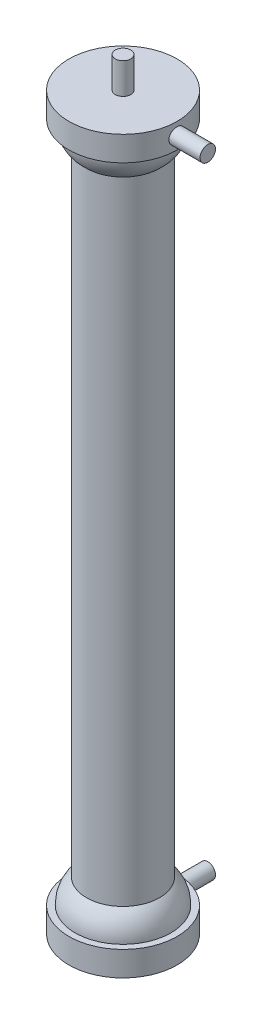
ISO-10303-21;
HEADER;
FILE_DESCRIPTION(('STEP AP214'),'2;1');
FILE_NAME('part.step','',(''),(''),'','','');
FILE_SCHEMA(('AUTOMOTIVE_DESIGN { 1 0 10303 214 1 1 1 1 }'));
ENDSEC;
DATA;
#1=APPLICATION_CONTEXT('core data for automotive mechanical design processes');
#2=APPLICATION_PROTOCOL_DEFINITION('international standard','automotive_design',2000,#1);
#3=PRODUCT_CONTEXT('',#1,'mechanical');
#4=PRODUCT('Part','Part','',(#3));
#5=PRODUCT_RELATED_PRODUCT_CATEGORY('part','',(#4));
#6=PRODUCT_DEFINITION_FORMATION('','',#4);
#7=PRODUCT_DEFINITION_CONTEXT('part definition',#1,'design');
#8=PRODUCT_DEFINITION('design','',#6,#7);
#9=PRODUCT_DEFINITION_SHAPE('','',#8);
#10=(LENGTH_UNIT() NAMED_UNIT(*) SI_UNIT(.MILLI.,.METRE.));
#11=(NAMED_UNIT(*) PLANE_ANGLE_UNIT() SI_UNIT($,.RADIAN.));
#12=(NAMED_UNIT(*) SI_UNIT($,.STERADIAN.) SOLID_ANGLE_UNIT());
#13=UNCERTAINTY_MEASURE_WITH_UNIT(LENGTH_MEASURE(1.E-05),#10,'distance_accuracy_value','');
#14=(GEOMETRIC_REPRESENTATION_CONTEXT(3) GLOBAL_UNCERTAINTY_ASSIGNED_CONTEXT((#13)) GLOBAL_UNIT_ASSIGNED_CONTEXT((#10,
#11,#12)) REPRESENTATION_CONTEXT('',''));
#15=CARTESIAN_POINT('',(0.,0.,0.));
#16=DIRECTION('',(0.,0.,1.));
#17=DIRECTION('',(1.,0.,0.));
#18=AXIS2_PLACEMENT_3D('',#15,#16,#17);
#19=CARTESIAN_POINT('',(0.,-1025.4,0.));
#20=DIRECTION('',(0.,-1.,0.));
#21=DIRECTION('',(0.,0.,-1.));
#22=AXIS2_PLACEMENT_3D('',#19,#20,#21);
#23=CYLINDRICAL_SURFACE('',#22,22.225);
#24=CARTESIAN_POINT('',(0.,302.54,0.));
#25=DIRECTION('',(0.,-1.,0.));
#26=DIRECTION('',(0.,0.,-1.));
#27=AXIS2_PLACEMENT_3D('',#24,#25,#26);
#28=CIRCLE('',#27,22.225);
#29=CARTESIAN_POINT('',(0.,302.54,-22.225));
#30=VERTEX_POINT('',#29);
#31=EDGE_CURVE('E107',#30,#30,#28,.T.);
#32=ORIENTED_EDGE('',*,*,#31,.F.);
#33=EDGE_LOOP('',(#32));
#34=FACE_BOUND('',#33,.T.);
#35=CARTESIAN_POINT('',(0.,312.7,0.));
#36=DIRECTION('',(0.,-1.,0.));
#37=DIRECTION('',(0.,0.,-1.));
#38=AXIS2_PLACEMENT_3D('',#35,#36,#37);
#39=CIRCLE('',#38,22.225);
#40=CARTESIAN_POINT('',(0.,312.7,-22.225));
#41=VERTEX_POINT('',#40);
#42=EDGE_CURVE('E111',#41,#41,#39,.T.);
#43=ORIENTED_EDGE('',*,*,#42,.T.);
#44=EDGE_LOOP('',(#43));
#45=FACE_BOUND('',#44,.T.);
#46=CARTESIAN_POINT('',(21.9970452561247,307.62,3.175));
#47=CARTESIAN_POINT('',(21.9970481082156,307.797362121844,3.17499260409125));
#48=CARTESIAN_POINT('',(21.9992135575726,307.974829606526,3.16008804904672));
#49=CARTESIAN_POINT('',(22.0076363111921,308.324809735322,3.10087549968881));
#50=CARTESIAN_POINT('',(22.0138976930162,308.49731726288,3.05653820399453));
#51=CARTESIAN_POINT('',(22.0297889769634,308.832260561296,2.93980772902896));
#52=CARTESIAN_POINT('',(22.0394163844335,308.994703686485,2.86743532306302));
#53=CARTESIAN_POINT('',(22.0609519822444,309.30511494553,2.69673666724123));
#54=CARTESIAN_POINT('',(22.0728598355627,309.453085213426,2.59841425167402));
#55=CARTESIAN_POINT('',(22.097711475932,309.731451669658,2.37784238108815));
#56=CARTESIAN_POINT('',(22.1106614947546,309.861727345762,2.25544152078387));
#57=CARTESIAN_POINT('',(22.1360825870052,310.099963222119,1.99051398786036));
#58=CARTESIAN_POINT('',(22.1485536348521,310.207922231816,1.84798624218868));
#59=CARTESIAN_POINT('',(22.1716764627384,310.398901442694,1.54608273463255));
#60=CARTESIAN_POINT('',(22.1823200989089,310.481811196798,1.38663642886806));
#61=CARTESIAN_POINT('',(22.2005199793149,310.619630042333,1.05590458421643));
#62=CARTESIAN_POINT('',(22.2080763718529,310.674540478803,0.884619614487445));
#63=CARTESIAN_POINT('',(22.2192064188926,310.754438116056,0.536311575871271));
#64=CARTESIAN_POINT('',(22.2228068738,310.779626761071,0.359335586048447));
#65=CARTESIAN_POINT('',(22.2257111283058,310.799990938974,0.00363468487948518));
#66=CARTESIAN_POINT('',(22.2250151455792,310.795167992371,-0.175090137405636));
#67=CARTESIAN_POINT('',(22.2194264377293,310.755805612082,-0.527842150095034));
#68=CARTESIAN_POINT('',(22.2145643168523,310.721482876774,-0.701894074636488));
#69=CARTESIAN_POINT('',(22.2012237809256,310.624434936478,-1.04174225726678));
#70=CARTESIAN_POINT('',(22.1927452799447,310.561709056582,-1.20753831907821));
#71=CARTESIAN_POINT('',(22.1730719283893,310.409410942656,-1.52682887224375));
#72=CARTESIAN_POINT('',(22.1618677947259,310.319746710099,-1.68027888605579));
#73=CARTESIAN_POINT('',(22.1379933588026,310.116184217775,-1.97003641446849));
#74=CARTESIAN_POINT('',(22.1253229689117,310.002284509229,-2.10634290346627));
#75=CARTESIAN_POINT('',(22.0997971284829,309.752275069839,-2.35922024831388));
#76=CARTESIAN_POINT('',(22.0869410354408,309.615976239261,-2.47560416314841));
#77=CARTESIAN_POINT('',(22.0626034152762,309.325682197231,-2.6838749597432));
#78=CARTESIAN_POINT('',(22.0511218951963,309.171686895119,-2.77576171599433));
#79=CARTESIAN_POINT('',(22.0308337272164,308.850185039774,-2.93245066164261));
#80=CARTESIAN_POINT('',(22.0220288503466,308.682669633161,-2.99723492899696));
#81=CARTESIAN_POINT('',(22.0081231447171,308.338982592026,-3.09769865136957));
#82=CARTESIAN_POINT('',(22.0030220802935,308.162811509003,-3.13337995814979));
#83=CARTESIAN_POINT('',(21.9971458195224,307.80847349683,-3.17437120217507));
#84=CARTESIAN_POINT('',(21.9963329630993,307.630337758732,-3.17994555628349));
#85=CARTESIAN_POINT('',(21.9990252889568,307.275674734523,-3.16126508092305));
#86=CARTESIAN_POINT('',(22.0025303501077,307.099147403431,-3.13701108822351));
#87=CARTESIAN_POINT('',(22.013429057337,306.753523164205,-3.05958617595134));
#88=CARTESIAN_POINT('',(22.0208051351058,306.584396395784,-3.0065458640302));
#89=CARTESIAN_POINT('',(22.0386003729932,306.257434784038,-2.87318936047202));
#90=CARTESIAN_POINT('',(22.0490196704401,306.099600450696,-2.79287193790103));
#91=CARTESIAN_POINT('',(22.071816543563,305.798515390942,-2.60660134525824));
#92=CARTESIAN_POINT('',(22.0842070451803,305.655371974075,-2.50047633043064));
#93=CARTESIAN_POINT('',(22.1095108174966,305.388832688745,-2.2658431604142));
#94=CARTESIAN_POINT('',(22.1224241149018,305.265437830706,-2.13733386064597));
#95=CARTESIAN_POINT('',(22.1474355820708,305.040955090736,-1.86041837447802));
#96=CARTESIAN_POINT('',(22.1595268892944,304.940041995818,-1.7118697857474));
#97=CARTESIAN_POINT('',(22.1814266422619,304.764602543522,-1.39977606882429));
#98=CARTESIAN_POINT('',(22.1912351456427,304.690075519916,-1.23623131940514));
#99=CARTESIAN_POINT('',(22.2074339607805,304.569805893524,-0.899344030292883));
#100=CARTESIAN_POINT('',(22.2138358055583,304.523966078054,-0.726036773609259));
#101=CARTESIAN_POINT('',(22.2225482509749,304.462056945968,-0.374086848735212));
#102=CARTESIAN_POINT('',(22.224859095647,304.445985853607,-0.195444499436444));
#103=CARTESIAN_POINT('',(22.2251271217915,304.444110620676,0.160405969870573));
#104=CARTESIAN_POINT('',(22.22312286098,304.458038424808,0.337612707029002));
#105=CARTESIAN_POINT('',(22.2150632703669,304.515193138193,0.687137680649272));
#106=CARTESIAN_POINT('',(22.2090079501298,304.558419978271,0.859455928651776));
#107=CARTESIAN_POINT('',(22.1935234001093,304.672853839167,1.19425039676431));
#108=CARTESIAN_POINT('',(22.1840962022546,304.744044011519,1.35673247545339));
#109=CARTESIAN_POINT('',(22.1629058916315,304.912355474359,1.6674873080394));
#110=CARTESIAN_POINT('',(22.1511427173455,305.009477447781,1.81575968757256));
#111=CARTESIAN_POINT('',(22.1264646284537,305.227871997916,2.09524909499349));
#112=CARTESIAN_POINT('',(22.1135407654047,305.349343039591,2.22631026403015));
#113=CARTESIAN_POINT('',(22.0880657969985,305.612570626879,2.46628787804758));
#114=CARTESIAN_POINT('',(22.0755147800215,305.754331936527,2.57519910777255));
#115=CARTESIAN_POINT('',(22.052138519243,306.054955883341,2.76827493516724));
#116=CARTESIAN_POINT('',(22.0413223436744,306.213901545958,2.85231132449519));
#117=CARTESIAN_POINT('',(22.0227465951902,306.54372627079,2.99237245226716));
#118=CARTESIAN_POINT('',(22.014983805506,306.714592549811,3.04842668700632));
#119=CARTESIAN_POINT('',(22.0052152641794,307.008552826015,3.11799692575808));
#120=CARTESIAN_POINT('',(22.0021674508921,307.129818632467,3.13934098015756));
#121=CARTESIAN_POINT('',(21.9980814690859,307.374039412681,3.16784500269689));
#122=CARTESIAN_POINT('',(21.9970432781193,307.49699436756,3.17500512927125));
#123=CARTESIAN_POINT('',(21.9970452561247,307.62,3.175));
#124=B_SPLINE_CURVE_WITH_KNOTS('',3,(#46,#47,#48,#49,#50,#51,#52,#53,#54,#55,#56,#57,#58,#59,
#60,#61,#62,#63,#64,#65,#66,#67,#68,#69,#70,#71,#72,#73,#74,#75,#76,#77,#78,#79,#80,#81,#82,#83,
#84,#85,#86,#87,#88,#89,#90,#91,#92,#93,#94,#95,#96,#97,#98,#99,#100,#101,#102,#103,#104,#105,
#106,#107,#108,#109,#110,#111,#112,#113,#114,#115,#116,#117,#118,#119,#120,#121,#122,#123),
.UNSPECIFIED.,.T.,.F.,(4,2,2,2,2,2,2,2,2,2,2,2,2,2,2,2,2,2,2,2,2,2,2,2,2,2,2,2,2,2,2,2,2,2,2,2,
2,2,4),(0.,0.531636842186723,1.06380374381045,1.59557707521229,2.12727187746934,
2.66242348592814,3.19760363644328,3.73511017448152,4.27259088918993,4.80640742645053,
5.34019691861478,5.8700985104056,6.40001269422939,6.93175759380699,7.46353428964397,
8.00005572303161,8.53657990518863,9.07345831563068,9.61030256293008,10.1424241696855,
10.6745308492684,11.2042432252682,11.7339795087708,12.2673446710569,12.8007371140035,
13.3381420041644,13.8755333242788,14.4110935764551,14.9466218806916,15.477384832952,
16.0081465320919,16.5385889260441,17.0690452910065,17.604015295275,18.1391111140454,
18.6769186963043,19.2141581662605,19.5828674249722,19.9515725651772),.UNSPECIFIED.);
#125=CARTESIAN_POINT('',(21.9970452561247,307.62,3.175));
#126=VERTEX_POINT('',#125);
#127=EDGE_CURVE('E68',#126,#126,#124,.T.);
#128=ORIENTED_EDGE('',*,*,#127,.T.);
#129=EDGE_LOOP('',(#128));
#130=FACE_BOUND('',#129,.T.);
#131=ADVANCED_FACE('F41',(#34,#45,#130),#23,.T.);
#132=CARTESIAN_POINT('',(0.,-1025.4,0.));
#133=DIRECTION('',(0.,-1.,0.));
#134=DIRECTION('',(0.,0.,-1.));
#135=AXIS2_PLACEMENT_3D('',#132,#133,#134);
#136=CYLINDRICAL_SURFACE('',#135,3.17499999999996);
#137=CARTESIAN_POINT('',(0.,325.4,0.));
#138=DIRECTION('',(0.,-1.,0.));
#139=DIRECTION('',(0.,0.,-1.));
#140=AXIS2_PLACEMENT_3D('',#137,#138,#139);
#141=CIRCLE('',#140,3.17499999999996);
#142=CARTESIAN_POINT('',(0.,325.4,-3.17499999999996));
#143=VERTEX_POINT('',#142);
#144=EDGE_CURVE('E54',#143,#143,#141,.T.);
#145=ORIENTED_EDGE('',*,*,#144,.T.);
#146=EDGE_LOOP('',(#145));
#147=FACE_BOUND('',#146,.T.);
#148=CARTESIAN_POINT('',(0.,312.7,0.));
#149=DIRECTION('',(0.,-1.,0.));
#150=DIRECTION('',(0.,0.,-1.));
#151=AXIS2_PLACEMENT_3D('',#148,#149,#150);
#152=CIRCLE('',#151,3.17499999999996);
#153=CARTESIAN_POINT('',(0.,312.7,-3.17499999999996));
#154=VERTEX_POINT('',#153);
#155=EDGE_CURVE('E76',#154,#154,#152,.T.);
#156=ORIENTED_EDGE('',*,*,#155,.F.);
#157=EDGE_LOOP('',(#156));
#158=FACE_BOUND('',#157,.T.);
#159=ADVANCED_FACE('F43',(#147,#158),#136,.T.);
#160=CARTESIAN_POINT('',(3.17499999999996,325.4,0.));
#161=DIRECTION('',(0.,1.,0.));
#162=DIRECTION('',(0.,0.,1.));
#163=AXIS2_PLACEMENT_3D('',#160,#161,#162);
#164=PLANE('',#163);
#165=ORIENTED_EDGE('',*,*,#144,.F.);
#166=EDGE_LOOP('',(#165));
#167=FACE_BOUND('',#166,.T.);
#168=ADVANCED_FACE('F103',(#167),#164,.T.);
#169=CARTESIAN_POINT('',(3.175,0.,0.));
#170=DIRECTION('',(0.,-1.,0.));
#171=DIRECTION('',(0.,0.,-1.));
#172=AXIS2_PLACEMENT_3D('',#169,#170,#171);
#173=PLANE('',#172);
#174=CARTESIAN_POINT('',(0.,0.,0.));
#175=DIRECTION('',(0.,-1.,0.));
#176=DIRECTION('',(0.,0.,-1.));
#177=AXIS2_PLACEMENT_3D('',#174,#175,#176);
#178=CIRCLE('',#177,3.175);
#179=CARTESIAN_POINT('',(0.,0.,-3.175));
#180=VERTEX_POINT('',#179);
#181=EDGE_CURVE('E59',#180,#180,#178,.T.);
#182=ORIENTED_EDGE('',*,*,#181,.T.);
#183=EDGE_LOOP('',(#182));
#184=FACE_BOUND('',#183,.T.);
#185=ADVANCED_FACE('F171',(#184),#173,.T.);
#186=CARTESIAN_POINT('',(0.,-1025.4,0.));
#187=DIRECTION('',(0.,-1.,0.));
#188=DIRECTION('',(0.,0.,-1.));
#189=AXIS2_PLACEMENT_3D('',#186,#187,#188);
#190=CYLINDRICAL_SURFACE('',#189,3.17499999999998);
#191=CARTESIAN_POINT('',(0.,12.6999999999999,0.));
#192=DIRECTION('',(0.,-1.,0.));
#193=DIRECTION('',(0.,0.,-1.));
#194=AXIS2_PLACEMENT_3D('',#191,#192,#193);
#195=CIRCLE('',#194,3.17499999999996);
#196=CARTESIAN_POINT('',(0.,12.6999999999999,-3.17499999999996));
#197=VERTEX_POINT('',#196);
#198=EDGE_CURVE('E65',#197,#197,#195,.T.);
#199=ORIENTED_EDGE('',*,*,#198,.T.);
#200=EDGE_LOOP('',(#199));
#201=FACE_BOUND('',#200,.T.);
#202=ORIENTED_EDGE('',*,*,#181,.F.);
#203=EDGE_LOOP('',(#202));
#204=FACE_BOUND('',#203,.T.);
#205=ADVANCED_FACE('F157',(#201,#204),#190,.T.);
#206=CARTESIAN_POINT('',(3.17499999999996,12.7,0.));
#207=DIRECTION('',(0.,-1.,0.));
#208=DIRECTION('',(0.,0.,-1.));
#209=AXIS2_PLACEMENT_3D('',#206,#207,#208);
#210=PLANE('',#209);
#211=CARTESIAN_POINT('',(0.,12.6999999999999,0.));
#212=DIRECTION('',(0.,-1.,0.));
#213=DIRECTION('',(0.,0.,-1.));
#214=AXIS2_PLACEMENT_3D('',#211,#212,#213);
#215=CIRCLE('',#214,22.225);
#216=CARTESIAN_POINT('',(0.,12.6999999999999,-22.225));
#217=VERTEX_POINT('',#216);
#218=EDGE_CURVE('E150',#217,#217,#215,.T.);
#219=ORIENTED_EDGE('',*,*,#218,.T.);
#220=EDGE_LOOP('',(#219));
#221=FACE_BOUND('',#220,.T.);
#222=ORIENTED_EDGE('',*,*,#198,.F.);
#223=EDGE_LOOP('',(#222));
#224=FACE_BOUND('',#223,.T.);
#225=ADVANCED_FACE('F160',(#221,#224),#210,.T.);
#226=CARTESIAN_POINT('',(0.,-1025.4,0.));
#227=DIRECTION('',(0.,-1.,0.));
#228=DIRECTION('',(0.,0.,-1.));
#229=AXIS2_PLACEMENT_3D('',#226,#227,#228);
#230=CYLINDRICAL_SURFACE('',#229,22.225);
#231=CARTESIAN_POINT('',(0.,20.9550000000001,-22.225));
#232=CARTESIAN_POINT('',(0.177372532942848,20.9549926130807,-22.2249972543515));
#233=CARTESIAN_POINT('',(0.354850399948254,20.940086367269,-22.2228543413594));
#234=CARTESIAN_POINT('',(0.704852096668646,20.8808664924571,-22.2145120385616));
#235=CARTESIAN_POINT('',(0.877370818068789,20.8365235993791,-22.2083086121327));
#236=CARTESIAN_POINT('',(1.21233779879378,20.7197767539939,-22.1925429326379));
#237=CARTESIAN_POINT('',(1.37479331768552,20.6473933100759,-22.1829831348434));
#238=CARTESIAN_POINT('',(1.68522538951301,20.4766686513073,-22.1615631533086));
#239=CARTESIAN_POINT('',(1.83320409151772,20.3783312973276,-22.1497033117895));
#240=CARTESIAN_POINT('',(2.11156121501147,20.1577442565439,-22.1249093670883));
#241=CARTESIAN_POINT('',(2.24182175079206,20.0353465089261,-22.1119689131174));
#242=CARTESIAN_POINT('',(2.48002835136539,19.7704315838366,-22.0865223693237));
#243=CARTESIAN_POINT('',(2.58797317910011,19.6279132917311,-22.0740163036128));
#244=CARTESIAN_POINT('',(2.77893740764058,19.3260182565293,-22.0507927185792));
#245=CARTESIAN_POINT('',(2.86184379837958,19.1665693430447,-22.0400834025882));
#246=CARTESIAN_POINT('',(2.99965570904621,18.8358318371159,-22.0217518243371));
#247=CARTESIAN_POINT('',(3.05456261243032,18.6645438301172,-22.0141294095569));
#248=CARTESIAN_POINT('',(3.13445309119421,18.3162257187961,-22.0028966652068));
#249=CARTESIAN_POINT('',(3.15963772607625,18.1392426142292,-21.9992593898744));
#250=CARTESIAN_POINT('',(3.1799914177403,17.7835277252445,-21.9963267795921));
#251=CARTESIAN_POINT('',(3.17516204015659,17.6047960325247,-21.9970312181636));
#252=CARTESIAN_POINT('',(3.13578932460962,17.2520719685675,-22.0026777932302));
#253=CARTESIAN_POINT('',(3.10146916470387,17.0780541025044,-22.0075880999923));
#254=CARTESIAN_POINT('',(3.00443812120536,16.7382727010475,-22.0210434511419));
#255=CARTESIAN_POINT('',(2.94172650310753,16.5725093793271,-22.0295885895644));
#256=CARTESIAN_POINT('',(2.78945822996728,16.2532591078808,-22.0493862330951));
#257=CARTESIAN_POINT('',(2.69980630064438,16.0998182181751,-22.0606483183298));
#258=CARTESIAN_POINT('',(2.4962702351622,15.810073751299,-22.0846038460095));
#259=CARTESIAN_POINT('',(2.38238465455236,15.6737711964325,-22.0972973737546));
#260=CARTESIAN_POINT('',(2.13238543141819,15.4208784701111,-22.1228264578543));
#261=CARTESIAN_POINT('',(1.99607975680891,15.3044780744347,-22.1356622590839));
#262=CARTESIAN_POINT('',(1.70576608109782,15.0961772586162,-22.1599225931851));
#263=CARTESIAN_POINT('',(1.55175801494516,15.0042769285084,-22.1713471208704));
#264=CARTESIAN_POINT('',(1.23025230140895,14.8475781359398,-22.1915080462026));
#265=CARTESIAN_POINT('',(1.06274783555435,14.7827934761779,-22.2002430742161));
#266=CARTESIAN_POINT('',(0.719084634272286,14.6823256349098,-22.2140291032861));
#267=CARTESIAN_POINT('',(0.542926429752161,14.6466406704939,-22.2190803300435));
#268=CARTESIAN_POINT('',(0.188595035544039,14.6056355924226,-22.2248999013422));
#269=CARTESIAN_POINT('',(0.0104526390235463,14.6000544192313,-22.2257050662886));
#270=CARTESIAN_POINT('',(-0.344225324872356,14.6187236327319,-22.2230417753747));
#271=CARTESIAN_POINT('',(-0.520760937101992,14.6429731840946,-22.2195734391824));
#272=CARTESIAN_POINT('',(-0.866429588550373,14.7203984572816,-22.2087756505003));
#273=CARTESIAN_POINT('',(-1.03559150406069,14.7734478139476,-22.2014630698402));
#274=CARTESIAN_POINT('',(-1.36261942363918,14.9068341361315,-22.1837944415749));
#275=CARTESIAN_POINT('',(-1.52048494016621,14.9871722785469,-22.1734382627095));
#276=CARTESIAN_POINT('',(-1.8215922670791,15.1734739344676,-22.1507427375886));
#277=CARTESIAN_POINT('',(-1.96473002515803,15.2796040446574,-22.1383906807312));
#278=CARTESIAN_POINT('',(-2.23125553050272,15.514243920733,-22.1131200870885));
#279=CARTESIAN_POINT('',(-2.35464224123725,15.6427548604219,-22.1002015206183));
#280=CARTESIAN_POINT('',(-2.57910591335467,15.9196670127811,-22.0751380976941));
#281=CARTESIAN_POINT('',(-2.6800084525968,16.0682102916021,-22.0629997770826));
#282=CARTESIAN_POINT('',(-2.85542940396839,16.3802904337339,-22.0409844847579));
#283=CARTESIAN_POINT('',(-2.92994847564319,16.5438269221092,-22.0311074565181));
#284=CARTESIAN_POINT('',(-3.05021314579171,16.8807182459038,-22.0147796029054));
#285=CARTESIAN_POINT('',(-3.09605251584503,17.0540390421606,-22.0083176225203));
#286=CARTESIAN_POINT('',(-3.15795617455243,17.4060176406758,-21.9995211720729));
#287=CARTESIAN_POINT('',(-3.17402231261418,17.5846751107383,-21.9971864456406));
#288=CARTESIAN_POINT('',(-3.17588249719059,17.9405181996026,-21.9969178067031));
#289=CARTESIAN_POINT('',(-3.16195070821392,18.1177024165028,-21.9989440373804));
#290=CARTESIAN_POINT('',(-3.10479592163144,18.4671813219428,-22.0070826718652));
#291=CARTESIAN_POINT('',(-3.06157295420644,18.6394760155204,-22.0131950714623));
#292=CARTESIAN_POINT('',(-2.94715637335701,18.974221108364,-22.0288038829555));
#293=CARTESIAN_POINT('',(-2.8759801345313,19.1366775504238,-22.0382981924558));
#294=CARTESIAN_POINT('',(-2.70770451922401,19.4473868813635,-22.0596038634222));
#295=CARTESIAN_POINT('',(-2.61060443067045,19.5956393799399,-22.0714152885321));
#296=CARTESIAN_POINT('',(-2.39223466597663,19.8751282369147,-22.0961531446146));
#297=CARTESIAN_POINT('',(-2.27076147542829,20.0062048205086,-22.1090884059355));
#298=CARTESIAN_POINT('',(-2.00752315239732,20.2462125355487,-22.1345414251083));
#299=CARTESIAN_POINT('',(-1.86575329213172,20.3551384930143,-22.1470590848466));
#300=CARTESIAN_POINT('',(-1.56512168644748,20.5482310206074,-22.1703370170694));
#301=CARTESIAN_POINT('',(-1.4061784764587,20.6322718134757,-22.1810882437725));
#302=CARTESIAN_POINT('',(-1.07635879528744,20.7723418436097,-22.1995326276888));
#303=CARTESIAN_POINT('',(-0.905495085753386,20.8284005285239,-22.2072289979989));
#304=CARTESIAN_POINT('',(-0.61152304034612,20.8979826942238,-22.2169095127051));
#305=CARTESIAN_POINT('',(-0.490242064945978,20.9193321086395,-22.2199281098463));
#306=CARTESIAN_POINT('',(-0.245990937667983,20.9478432469276,-22.2239742949424));
#307=CARTESIAN_POINT('',(-0.123020803969107,20.9550051233682,-22.2250019043077));
#308=CARTESIAN_POINT('',(0.,20.9550000000001,-22.225));
#309=B_SPLINE_CURVE_WITH_KNOTS('',3,(#231,#232,#233,#234,#235,#236,#237,#238,#239,#240,#241,
#242,#243,#244,#245,#246,#247,#248,#249,#250,#251,#252,#253,#254,#255,#256,#257,#258,#259,#260,
#261,#262,#263,#264,#265,#266,#267,#268,#269,#270,#271,#272,#273,#274,#275,#276,#277,#278,#279,
#280,#281,#282,#283,#284,#285,#286,#287,#288,#289,#290,#291,#292,#293,#294,#295,#296,#297,#298,
#299,#300,#301,#302,#303,#304,#305,#306,#307,#308),.UNSPECIFIED.,.T.,.F.,(4,2,2,2,2,2,2,2,2,2,2,
2,2,2,2,2,2,2,2,2,2,2,2,2,2,2,2,2,2,2,2,2,2,2,2,2,2,2,4),(0.,0.531668122197687,1.06386558878679,
1.59567454771252,2.12740443995393,2.66251510386462,3.19765542336744,3.73517617335122,
4.27267036182591,4.80650738344103,5.34031655851175,5.87012123820308,6.39993962506167,
6.93165421549765,7.463400507747,7.99996426271881,8.53652998946081,9.07336851324164,
9.61017414298083,10.1423170293666,10.6744450148605,11.2042568290739,11.7340914956542,
12.2674439687878,12.8008244229882,13.3382087300045,13.8755796023068,14.411184168761,
14.9467554642422,15.4774527230731,16.0081494350893,16.5385168086807,17.068898751814,
17.6039089042129,18.1390438820047,18.6768391543641,19.2140672653074,19.5828218978377,
19.9515725648792),.UNSPECIFIED.);
#310=CARTESIAN_POINT('',(0.,20.9550000000001,-22.225));
#311=VERTEX_POINT('',#310);
#312=EDGE_CURVE('E10',#311,#311,#309,.T.);
#313=ORIENTED_EDGE('',*,*,#312,.F.);
#314=EDGE_LOOP('',(#313));
#315=FACE_BOUND('',#314,.T.);
#316=CARTESIAN_POINT('',(0.,22.8600000000001,0.));
#317=DIRECTION('',(0.,-1.,0.));
#318=DIRECTION('',(0.,0.,-1.));
#319=AXIS2_PLACEMENT_3D('',#316,#317,#318);
#320=CIRCLE('',#319,22.225);
#321=CARTESIAN_POINT('',(0.,22.8600000000001,-22.225));
#322=VERTEX_POINT('',#321);
#323=EDGE_CURVE('E146',#322,#322,#320,.T.);
#324=ORIENTED_EDGE('',*,*,#323,.T.);
#325=EDGE_LOOP('',(#324));
#326=FACE_BOUND('',#325,.T.);
#327=ORIENTED_EDGE('',*,*,#218,.F.);
#328=EDGE_LOOP('',(#327));
#329=FACE_BOUND('',#328,.T.);
#330=ADVANCED_FACE('F162',(#315,#326,#329),#230,.T.);
#331=CARTESIAN_POINT('',(19.685,22.86,0.));
#332=DIRECTION('',(0.,1.,0.));
#333=DIRECTION('',(0.,0.,1.));
#334=AXIS2_PLACEMENT_3D('',#331,#332,#333);
#335=PLANE('',#334);
#336=CARTESIAN_POINT('',(0.,22.8600000000001,0.));
#337=DIRECTION('',(0.,-1.,0.));
#338=DIRECTION('',(0.,0.,-1.));
#339=AXIS2_PLACEMENT_3D('',#336,#337,#338);
#340=CIRCLE('',#339,19.685);
#341=CARTESIAN_POINT('',(0.,22.8600000000001,-19.685));
#342=VERTEX_POINT('',#341);
#343=EDGE_CURVE('E142',#342,#342,#340,.T.);
#344=ORIENTED_EDGE('',*,*,#343,.T.);
#345=EDGE_LOOP('',(#344));
#346=FACE_BOUND('',#345,.T.);
#347=ORIENTED_EDGE('',*,*,#323,.F.);
#348=EDGE_LOOP('',(#347));
#349=FACE_BOUND('',#348,.T.);
#350=ADVANCED_FACE('F169',(#346,#349),#335,.T.);
#351=CARTESIAN_POINT('',(0.,23.1656243769075,0.));
#352=DIRECTION('',(0.,-1.,0.));
#353=DIRECTION('',(0.,0.,-1.));
#354=AXIS2_PLACEMENT_3D('',#351,#352,#353);
#355=DEGENERATE_TOROIDAL_SURFACE('',#354,6.98867794437145,12.7,.T.);
#356=CARTESIAN_POINT('',(0.,33.0200000000001,0.));
#357=DIRECTION('',(0.,-1.,0.));
#358=DIRECTION('',(0.,0.,-1.));
#359=AXIS2_PLACEMENT_3D('',#356,#357,#358);
#360=CIRCLE('',#359,15.);
#361=CARTESIAN_POINT('',(0.,33.0200000000001,-15.));
#362=VERTEX_POINT('',#361);
#363=EDGE_CURVE('E138',#362,#362,#360,.T.);
#364=ORIENTED_EDGE('',*,*,#363,.T.);
#365=EDGE_LOOP('',(#364));
#366=FACE_BOUND('',#365,.T.);
#367=ORIENTED_EDGE('',*,*,#343,.F.);
#368=EDGE_LOOP('',(#367));
#369=FACE_BOUND('',#368,.T.);
#370=ADVANCED_FACE('F208',(#366,#369),#355,.T.);
#371=CARTESIAN_POINT('',(0.,-1025.4,0.));
#372=DIRECTION('',(0.,-1.,0.));
#373=DIRECTION('',(0.,0.,-1.));
#374=AXIS2_PLACEMENT_3D('',#371,#372,#373);
#375=CYLINDRICAL_SURFACE('',#374,15.);
#376=CARTESIAN_POINT('',(0.,292.38,0.));
#377=DIRECTION('',(0.,-1.,0.));
#378=DIRECTION('',(0.,0.,-1.));
#379=AXIS2_PLACEMENT_3D('',#376,#377,#378);
#380=CIRCLE('',#379,15.);
#381=CARTESIAN_POINT('',(0.,292.38,-15.));
#382=VERTEX_POINT('',#381);
#383=EDGE_CURVE('E134',#382,#382,#380,.T.);
#384=ORIENTED_EDGE('',*,*,#383,.T.);
#385=EDGE_LOOP('',(#384));
#386=FACE_BOUND('',#385,.T.);
#387=ORIENTED_EDGE('',*,*,#363,.F.);
#388=EDGE_LOOP('',(#387));
#389=FACE_BOUND('',#388,.T.);
#390=ADVANCED_FACE('F218',(#386,#389),#375,.T.);
#391=CARTESIAN_POINT('',(0.,302.234375623092,0.));
#392=DIRECTION('',(0.,-1.,0.));
#393=DIRECTION('',(0.,0.,-1.));
#394=AXIS2_PLACEMENT_3D('',#391,#392,#393);
#395=DEGENERATE_TOROIDAL_SURFACE('',#394,6.98867794437145,12.7,.T.);
#396=CARTESIAN_POINT('',(0.,302.54,0.));
#397=DIRECTION('',(0.,-1.,0.));
#398=DIRECTION('',(0.,0.,-1.));
#399=AXIS2_PLACEMENT_3D('',#396,#397,#398);
#400=CIRCLE('',#399,19.685);
#401=CARTESIAN_POINT('',(0.,302.54,-19.685));
#402=VERTEX_POINT('',#401);
#403=EDGE_CURVE('E130',#402,#402,#400,.T.);
#404=ORIENTED_EDGE('',*,*,#403,.T.);
#405=EDGE_LOOP('',(#404));
#406=FACE_BOUND('',#405,.T.);
#407=ORIENTED_EDGE('',*,*,#383,.F.);
#408=EDGE_LOOP('',(#407));
#409=FACE_BOUND('',#408,.T.);
#410=ADVANCED_FACE('F94',(#406,#409),#395,.T.);
#411=CARTESIAN_POINT('',(19.685,302.54,0.));
#412=DIRECTION('',(0.,-1.,0.));
#413=DIRECTION('',(0.,0.,-1.));
#414=AXIS2_PLACEMENT_3D('',#411,#412,#413);
#415=PLANE('',#414);
#416=ORIENTED_EDGE('',*,*,#31,.T.);
#417=EDGE_LOOP('',(#416));
#418=FACE_BOUND('',#417,.T.);
#419=ORIENTED_EDGE('',*,*,#403,.F.);
#420=EDGE_LOOP('',(#419));
#421=FACE_BOUND('',#420,.T.);
#422=ADVANCED_FACE('F89',(#418,#421),#415,.T.);
#423=CARTESIAN_POINT('',(3.17499999999996,312.7,0.));
#424=DIRECTION('',(0.,1.,0.));
#425=DIRECTION('',(0.,0.,1.));
#426=AXIS2_PLACEMENT_3D('',#423,#424,#425);
#427=PLANE('',#426);
#428=ORIENTED_EDGE('',*,*,#155,.T.);
#429=EDGE_LOOP('',(#428));
#430=FACE_BOUND('',#429,.T.);
#431=ORIENTED_EDGE('',*,*,#42,.F.);
#432=EDGE_LOOP('',(#431));
#433=FACE_BOUND('',#432,.T.);
#434=ADVANCED_FACE('F86',(#430,#433),#427,.T.);
#435=CARTESIAN_POINT('',(34.798,307.62,0.));
#436=DIRECTION('',(-1.,0.,0.));
#437=DIRECTION('',(0.,0.,1.));
#438=AXIS2_PLACEMENT_3D('',#435,#436,#437);
#439=CYLINDRICAL_SURFACE('',#438,3.175);
#440=ORIENTED_EDGE('',*,*,#127,.F.);
#441=EDGE_LOOP('',(#440));
#442=FACE_BOUND('',#441,.T.);
#443=CARTESIAN_POINT('',(34.798,307.62,0.));
#444=DIRECTION('',(1.,0.,0.));
#445=DIRECTION('',(0.,0.,-1.));
#446=AXIS2_PLACEMENT_3D('',#443,#444,#445);
#447=CIRCLE('',#446,3.175);
#448=CARTESIAN_POINT('',(34.798,307.62,-3.175));
#449=VERTEX_POINT('',#448);
#450=EDGE_CURVE('E77',#449,#449,#447,.T.);
#451=ORIENTED_EDGE('',*,*,#450,.F.);
#452=EDGE_LOOP('',(#451));
#453=FACE_BOUND('',#452,.T.);
#454=ADVANCED_FACE('F81',(#442,#453),#439,.T.);
#455=CARTESIAN_POINT('',(34.798,307.62,0.));
#456=DIRECTION('',(1.,0.,0.));
#457=DIRECTION('',(0.,0.,-1.));
#458=AXIS2_PLACEMENT_3D('',#455,#456,#457);
#459=PLANE('',#458);
#460=ORIENTED_EDGE('',*,*,#450,.T.);
#461=EDGE_LOOP('',(#460));
#462=FACE_BOUND('',#461,.T.);
#463=ADVANCED_FACE('F85',(#462),#459,.T.);
#464=CARTESIAN_POINT('',(0.,17.78,-34.798));
#465=DIRECTION('',(0.,0.,1.));
#466=DIRECTION('',(1.,0.,0.));
#467=AXIS2_PLACEMENT_3D('',#464,#465,#466);
#468=CYLINDRICAL_SURFACE('',#467,3.175);
#469=ORIENTED_EDGE('',*,*,#312,.T.);
#470=EDGE_LOOP('',(#469));
#471=FACE_BOUND('',#470,.T.);
#472=CARTESIAN_POINT('',(0.,17.78,-34.798));
#473=DIRECTION('',(0.,0.,1.));
#474=DIRECTION('',(1.,0.,0.));
#475=AXIS2_PLACEMENT_3D('',#472,#473,#474);
#476=CIRCLE('',#475,3.175);
#477=CARTESIAN_POINT('',(3.175,17.78,-34.798));
#478=VERTEX_POINT('',#477);
#479=EDGE_CURVE('E118',#478,#478,#476,.T.);
#480=ORIENTED_EDGE('',*,*,#479,.T.);
#481=EDGE_LOOP('',(#480));
#482=FACE_BOUND('',#481,.T.);
#483=ADVANCED_FACE('F272',(#471,#482),#468,.T.);
#484=CARTESIAN_POINT('',(0.,17.78,-34.798));
#485=DIRECTION('',(0.,0.,1.));
#486=DIRECTION('',(1.,0.,0.));
#487=AXIS2_PLACEMENT_3D('',#484,#485,#486);
#488=PLANE('',#487);
#489=ORIENTED_EDGE('',*,*,#479,.F.);
#490=EDGE_LOOP('',(#489));
#491=FACE_BOUND('',#490,.T.);
#492=ADVANCED_FACE('F287',(#491),#488,.F.);
#493=CLOSED_SHELL('',(#131,#159,#168,#185,#205,#225,#330,#350,#370,#390,#410,#422,#434,#454,
#463,#483,#492));
#494=MANIFOLD_SOLID_BREP('B2',#493);
#495=ADVANCED_BREP_SHAPE_REPRESENTATION('',(#18,#494),#14);
#496=SHAPE_DEFINITION_REPRESENTATION(#9,#495);
ENDSEC;
END-ISO-10303-21;
